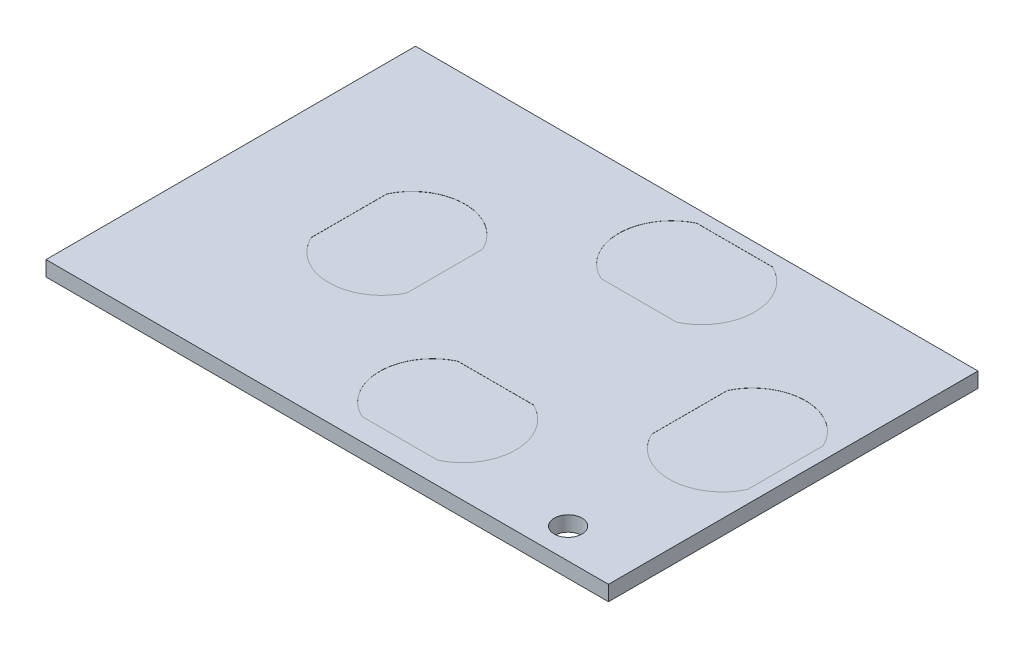
ISO-10303-21;
HEADER;
FILE_DESCRIPTION(('STEP AP214'),'2;1');
FILE_NAME('part.step','',(''),(''),'','','');
FILE_SCHEMA(('AUTOMOTIVE_DESIGN { 1 0 10303 214 1 1 1 1 }'));
ENDSEC;
DATA;
#1=APPLICATION_CONTEXT('core data for automotive mechanical design processes');
#2=APPLICATION_PROTOCOL_DEFINITION('international standard','automotive_design',2000,#1);
#3=PRODUCT_CONTEXT('',#1,'mechanical');
#4=PRODUCT('Part','Part','',(#3));
#5=PRODUCT_RELATED_PRODUCT_CATEGORY('part','',(#4));
#6=PRODUCT_DEFINITION_FORMATION('','',#4);
#7=PRODUCT_DEFINITION_CONTEXT('part definition',#1,'design');
#8=PRODUCT_DEFINITION('design','',#6,#7);
#9=PRODUCT_DEFINITION_SHAPE('','',#8);
#10=(LENGTH_UNIT() NAMED_UNIT(*) SI_UNIT(.MILLI.,.METRE.));
#11=(NAMED_UNIT(*) PLANE_ANGLE_UNIT() SI_UNIT($,.RADIAN.));
#12=(NAMED_UNIT(*) SI_UNIT($,.STERADIAN.) SOLID_ANGLE_UNIT());
#13=UNCERTAINTY_MEASURE_WITH_UNIT(LENGTH_MEASURE(1.E-05),#10,'distance_accuracy_value','');
#14=(GEOMETRIC_REPRESENTATION_CONTEXT(3) GLOBAL_UNCERTAINTY_ASSIGNED_CONTEXT((#13)) GLOBAL_UNIT_ASSIGNED_CONTEXT((#10,
#11,#12)) REPRESENTATION_CONTEXT('',''));
#15=CARTESIAN_POINT('',(0.,0.,0.));
#16=DIRECTION('',(0.,0.,1.));
#17=DIRECTION('',(1.,0.,0.));
#18=AXIS2_PLACEMENT_3D('',#15,#16,#17);
#19=CARTESIAN_POINT('',(0.,1.2,0.));
#20=DIRECTION('',(0.,-1.,0.));
#21=DIRECTION('',(0.,0.,-1.));
#22=AXIS2_PLACEMENT_3D('',#19,#20,#21);
#23=PLANE('',#22);
#24=DIRECTION('',(1.,0.,0.));
#25=VECTOR('',#24,1.);
#26=CARTESIAN_POINT('',(6.99999999999999,1.2,-6.05));
#27=LINE('',#26,#25);
#28=CARTESIAN_POINT('',(0.999999999999994,1.2,-6.05));
#29=VERTEX_POINT('',#28);
#30=CARTESIAN_POINT('',(6.99999999999999,1.2,-6.05));
#31=VERTEX_POINT('',#30);
#32=EDGE_CURVE('E202',#29,#31,#27,.T.);
#33=ORIENTED_EDGE('',*,*,#32,.F.);
#34=CARTESIAN_POINT('',(2.80833333333333,1.2,-9.85));
#35=DIRECTION('',(0.,1.,0.));
#36=DIRECTION('',(0.,0.,1.));
#37=AXIS2_PLACEMENT_3D('',#34,#35,#36);
#38=CIRCLE('',#37,4.20833333333334);
#39=CARTESIAN_POINT('',(0.999999999999994,1.2,-13.65));
#40=VERTEX_POINT('',#39);
#41=EDGE_CURVE('E51',#40,#29,#38,.T.);
#42=ORIENTED_EDGE('',*,*,#41,.F.);
#43=DIRECTION('',(-1.,0.,0.));
#44=VECTOR('',#43,1.);
#45=CARTESIAN_POINT('',(0.999999999999994,1.2,-13.65));
#46=LINE('',#45,#44);
#47=CARTESIAN_POINT('',(6.99999999999999,1.2,-13.65));
#48=VERTEX_POINT('',#47);
#49=EDGE_CURVE('E193',#48,#40,#46,.T.);
#50=ORIENTED_EDGE('',*,*,#49,.F.);
#51=CARTESIAN_POINT('',(5.19166666666666,1.2,-9.85));
#52=DIRECTION('',(0.,1.,0.));
#53=DIRECTION('',(0.,0.,-1.));
#54=AXIS2_PLACEMENT_3D('',#51,#52,#53);
#55=CIRCLE('',#54,4.20833333333334);
#56=EDGE_CURVE('E196',#31,#48,#55,.T.);
#57=ORIENTED_EDGE('',*,*,#56,.F.);
#58=EDGE_LOOP('',(#33,#42,#50,#57));
#59=FACE_BOUND('',#58,.T.);
#60=DIRECTION('',(0.,0.,-1.));
#61=VECTOR('',#60,1.);
#62=CARTESIAN_POINT('',(-5.70000000000001,1.2,2.625));
#63=LINE('',#62,#61);
#64=CARTESIAN_POINT('',(-5.70000000000001,1.2,2.625));
#65=VERTEX_POINT('',#64);
#66=CARTESIAN_POINT('',(-5.70000000000001,1.2,-3.375));
#67=VERTEX_POINT('',#66);
#68=EDGE_CURVE('E228',#65,#67,#63,.T.);
#69=ORIENTED_EDGE('',*,*,#68,.F.);
#70=CARTESIAN_POINT('',(-9.50000000000001,1.2,0.816666666666664));
#71=DIRECTION('',(0.,1.,0.));
#72=DIRECTION('',(0.,0.,1.));
#73=AXIS2_PLACEMENT_3D('',#70,#71,#72);
#74=CIRCLE('',#73,4.20833333333334);
#75=CARTESIAN_POINT('',(-13.3,1.2,2.625));
#76=VERTEX_POINT('',#75);
#77=EDGE_CURVE('E59',#76,#65,#74,.T.);
#78=ORIENTED_EDGE('',*,*,#77,.F.);
#79=DIRECTION('',(0.,0.,1.));
#80=VECTOR('',#79,1.);
#81=CARTESIAN_POINT('',(-13.3,1.2,-3.375));
#82=LINE('',#81,#80);
#83=CARTESIAN_POINT('',(-13.3,1.2,-3.375));
#84=VERTEX_POINT('',#83);
#85=EDGE_CURVE('E217',#84,#76,#82,.T.);
#86=ORIENTED_EDGE('',*,*,#85,.F.);
#87=CARTESIAN_POINT('',(-9.50000000000001,1.2,-1.56666666666666));
#88=DIRECTION('',(0.,1.,0.));
#89=DIRECTION('',(0.,0.,-1.));
#90=AXIS2_PLACEMENT_3D('',#87,#88,#89);
#91=CIRCLE('',#90,4.20833333333333);
#92=EDGE_CURVE('E232',#67,#84,#91,.T.);
#93=ORIENTED_EDGE('',*,*,#92,.F.);
#94=EDGE_LOOP('',(#69,#78,#86,#93));
#95=FACE_BOUND('',#94,.T.);
#96=DIRECTION('',(1.,0.,0.));
#97=VECTOR('',#96,1.);
#98=CARTESIAN_POINT('',(7.,1.2,12.9));
#99=LINE('',#98,#97);
#100=CARTESIAN_POINT('',(0.999999999999994,1.2,12.9));
#101=VERTEX_POINT('',#100);
#102=CARTESIAN_POINT('',(7.,1.2,12.9));
#103=VERTEX_POINT('',#102);
#104=EDGE_CURVE('E259',#101,#103,#99,.T.);
#105=ORIENTED_EDGE('',*,*,#104,.F.);
#106=CARTESIAN_POINT('',(2.80833333333333,1.2,9.1));
#107=DIRECTION('',(0.,1.,0.));
#108=DIRECTION('',(0.,0.,1.));
#109=AXIS2_PLACEMENT_3D('',#106,#107,#108);
#110=CIRCLE('',#109,4.20833333333333);
#111=CARTESIAN_POINT('',(0.999999999999994,1.2,5.3));
#112=VERTEX_POINT('',#111);
#113=EDGE_CURVE('E257',#112,#101,#110,.T.);
#114=ORIENTED_EDGE('',*,*,#113,.F.);
#115=DIRECTION('',(-1.,0.,0.));
#116=VECTOR('',#115,1.);
#117=CARTESIAN_POINT('',(0.999999999999994,1.2,5.3));
#118=LINE('',#117,#116);
#119=CARTESIAN_POINT('',(6.99999999999999,1.2,5.30000000000001));
#120=VERTEX_POINT('',#119);
#121=EDGE_CURVE('E247',#120,#112,#118,.T.);
#122=ORIENTED_EDGE('',*,*,#121,.F.);
#123=CARTESIAN_POINT('',(5.19166666666666,1.2,9.1));
#124=DIRECTION('',(0.,1.,0.));
#125=DIRECTION('',(0.,0.,-1.));
#126=AXIS2_PLACEMENT_3D('',#123,#124,#125);
#127=CIRCLE('',#126,4.20833333333333);
#128=EDGE_CURVE('E263',#103,#120,#127,.T.);
#129=ORIENTED_EDGE('',*,*,#128,.F.);
#130=EDGE_LOOP('',(#105,#114,#122,#129));
#131=FACE_BOUND('',#130,.T.);
#132=DIRECTION('',(0.,0.,-1.));
#133=VECTOR('',#132,1.);
#134=CARTESIAN_POINT('',(21.3,1.2,2.625));
#135=LINE('',#134,#133);
#136=CARTESIAN_POINT('',(21.3,1.2,2.625));
#137=VERTEX_POINT('',#136);
#138=CARTESIAN_POINT('',(21.3,1.2,-3.375));
#139=VERTEX_POINT('',#138);
#140=EDGE_CURVE('E291',#137,#139,#135,.T.);
#141=ORIENTED_EDGE('',*,*,#140,.F.);
#142=CARTESIAN_POINT('',(17.5,1.2,0.816666666666664));
#143=DIRECTION('',(0.,1.,0.));
#144=DIRECTION('',(0.,0.,1.));
#145=AXIS2_PLACEMENT_3D('',#142,#143,#144);
#146=CIRCLE('',#145,4.20833333333334);
#147=CARTESIAN_POINT('',(13.7,1.2,2.625));
#148=VERTEX_POINT('',#147);
#149=EDGE_CURVE('E289',#148,#137,#146,.T.);
#150=ORIENTED_EDGE('',*,*,#149,.F.);
#151=DIRECTION('',(0.,0.,1.));
#152=VECTOR('',#151,1.);
#153=CARTESIAN_POINT('',(13.7,1.2,-3.375));
#154=LINE('',#153,#152);
#155=CARTESIAN_POINT('',(13.7,1.2,-3.375));
#156=VERTEX_POINT('',#155);
#157=EDGE_CURVE('E279',#156,#148,#154,.T.);
#158=ORIENTED_EDGE('',*,*,#157,.F.);
#159=CARTESIAN_POINT('',(17.5,1.2,-1.56666666666666));
#160=DIRECTION('',(0.,1.,0.));
#161=DIRECTION('',(0.,0.,-1.));
#162=AXIS2_PLACEMENT_3D('',#159,#160,#161);
#163=CIRCLE('',#162,4.20833333333334);
#164=EDGE_CURVE('E294',#139,#156,#163,.T.);
#165=ORIENTED_EDGE('',*,*,#164,.F.);
#166=EDGE_LOOP('',(#141,#150,#158,#165));
#167=FACE_BOUND('',#166,.T.);
#168=DIRECTION('',(0.,0.,1.));
#169=VECTOR('',#168,1.);
#170=CARTESIAN_POINT('',(-22.3,1.2,14.65));
#171=LINE('',#170,#169);
#172=CARTESIAN_POINT('',(-22.3,1.2,-14.65));
#173=VERTEX_POINT('',#172);
#174=CARTESIAN_POINT('',(-22.3,1.2,14.65));
#175=VERTEX_POINT('',#174);
#176=EDGE_CURVE('E312',#173,#175,#171,.T.);
#177=ORIENTED_EDGE('',*,*,#176,.T.);
#178=DIRECTION('',(1.,0.,0.));
#179=VECTOR('',#178,1.);
#180=CARTESIAN_POINT('',(22.3,1.2,14.65));
#181=LINE('',#180,#179);
#182=CARTESIAN_POINT('',(22.3,1.2,14.65));
#183=VERTEX_POINT('',#182);
#184=EDGE_CURVE('E315',#175,#183,#181,.T.);
#185=ORIENTED_EDGE('',*,*,#184,.T.);
#186=DIRECTION('',(0.,0.,-1.));
#187=VECTOR('',#186,1.);
#188=CARTESIAN_POINT('',(22.3,1.2,-14.65));
#189=LINE('',#188,#187);
#190=CARTESIAN_POINT('',(22.3,1.2,-14.65));
#191=VERTEX_POINT('',#190);
#192=EDGE_CURVE('E318',#183,#191,#189,.T.);
#193=ORIENTED_EDGE('',*,*,#192,.T.);
#194=DIRECTION('',(-1.,0.,0.));
#195=VECTOR('',#194,1.);
#196=CARTESIAN_POINT('',(-22.3,1.2,-14.65));
#197=LINE('',#196,#195);
#198=EDGE_CURVE('E320',#191,#173,#197,.T.);
#199=ORIENTED_EDGE('',*,*,#198,.T.);
#200=EDGE_LOOP('',(#177,#185,#193,#199));
#201=FACE_BOUND('',#200,.T.);
#202=CARTESIAN_POINT('',(16.7,1.2,12.25));
#203=DIRECTION('',(0.,1.,0.));
#204=DIRECTION('',(0.,0.,1.));
#205=AXIS2_PLACEMENT_3D('',#202,#203,#204);
#206=CIRCLE('',#205,1.1);
#207=CARTESIAN_POINT('',(16.7,1.2,13.35));
#208=VERTEX_POINT('',#207);
#209=EDGE_CURVE('E306',#208,#208,#206,.T.);
#210=ORIENTED_EDGE('',*,*,#209,.F.);
#211=EDGE_LOOP('',(#210));
#212=FACE_BOUND('',#211,.T.);
#213=ADVANCED_FACE('F36',(#59,#95,#131,#167,#201,#212),#23,.F.);
#214=CARTESIAN_POINT('',(0.,0.,0.));
#215=DIRECTION('',(0.,-1.,0.));
#216=DIRECTION('',(0.,0.,-1.));
#217=AXIS2_PLACEMENT_3D('',#214,#215,#216);
#218=PLANE('',#217);
#219=DIRECTION('',(0.,0.,1.));
#220=VECTOR('',#219,1.);
#221=CARTESIAN_POINT('',(-22.3,0.,14.65));
#222=LINE('',#221,#220);
#223=CARTESIAN_POINT('',(-22.3,0.,-14.65));
#224=VERTEX_POINT('',#223);
#225=CARTESIAN_POINT('',(-22.3,0.,14.65));
#226=VERTEX_POINT('',#225);
#227=EDGE_CURVE('E309',#224,#226,#222,.T.);
#228=ORIENTED_EDGE('',*,*,#227,.F.);
#229=DIRECTION('',(-1.,0.,0.));
#230=VECTOR('',#229,1.);
#231=CARTESIAN_POINT('',(-22.3,0.,-14.65));
#232=LINE('',#231,#230);
#233=CARTESIAN_POINT('',(22.3,0.,-14.65));
#234=VERTEX_POINT('',#233);
#235=EDGE_CURVE('E316',#234,#224,#232,.T.);
#236=ORIENTED_EDGE('',*,*,#235,.F.);
#237=DIRECTION('',(0.,0.,-1.));
#238=VECTOR('',#237,1.);
#239=CARTESIAN_POINT('',(22.3,0.,-14.65));
#240=LINE('',#239,#238);
#241=CARTESIAN_POINT('',(22.3,0.,14.65));
#242=VERTEX_POINT('',#241);
#243=EDGE_CURVE('E327',#242,#234,#240,.T.);
#244=ORIENTED_EDGE('',*,*,#243,.F.);
#245=DIRECTION('',(1.,0.,0.));
#246=VECTOR('',#245,1.);
#247=CARTESIAN_POINT('',(22.3,0.,14.65));
#248=LINE('',#247,#246);
#249=EDGE_CURVE('E325',#226,#242,#248,.T.);
#250=ORIENTED_EDGE('',*,*,#249,.F.);
#251=EDGE_LOOP('',(#228,#236,#244,#250));
#252=FACE_BOUND('',#251,.T.);
#253=CARTESIAN_POINT('',(16.7,0.,12.25));
#254=DIRECTION('',(0.,1.,0.));
#255=DIRECTION('',(0.,0.,1.));
#256=AXIS2_PLACEMENT_3D('',#253,#254,#255);
#257=CIRCLE('',#256,1.1);
#258=CARTESIAN_POINT('',(16.7,0.,13.35));
#259=VERTEX_POINT('',#258);
#260=EDGE_CURVE('E209',#259,#259,#257,.T.);
#261=ORIENTED_EDGE('',*,*,#260,.T.);
#262=EDGE_LOOP('',(#261));
#263=FACE_BOUND('',#262,.T.);
#264=ADVANCED_FACE('F345',(#252,#263),#218,.T.);
#265=CARTESIAN_POINT('',(-22.3,1.2,14.65));
#266=DIRECTION('',(1.,0.,0.));
#267=DIRECTION('',(0.,0.,-1.));
#268=AXIS2_PLACEMENT_3D('',#265,#266,#267);
#269=PLANE('',#268);
#270=ORIENTED_EDGE('',*,*,#227,.T.);
#271=DIRECTION('',(0.,-1.,0.));
#272=VECTOR('',#271,1.);
#273=CARTESIAN_POINT('',(-22.3,1.2,14.65));
#274=LINE('',#273,#272);
#275=EDGE_CURVE('E11',#175,#226,#274,.T.);
#276=ORIENTED_EDGE('',*,*,#275,.F.);
#277=ORIENTED_EDGE('',*,*,#176,.F.);
#278=DIRECTION('',(0.,-1.,0.));
#279=VECTOR('',#278,1.);
#280=CARTESIAN_POINT('',(-22.3,1.2,-14.65));
#281=LINE('',#280,#279);
#282=EDGE_CURVE('E322',#173,#224,#281,.T.);
#283=ORIENTED_EDGE('',*,*,#282,.T.);
#284=EDGE_LOOP('',(#270,#276,#277,#283));
#285=FACE_BOUND('',#284,.T.);
#286=ADVANCED_FACE('F38',(#285),#269,.F.);
#287=CARTESIAN_POINT('',(22.3,1.2,14.65));
#288=DIRECTION('',(0.,0.,-1.));
#289=DIRECTION('',(-1.,0.,0.));
#290=AXIS2_PLACEMENT_3D('',#287,#288,#289);
#291=PLANE('',#290);
#292=ORIENTED_EDGE('',*,*,#249,.T.);
#293=DIRECTION('',(0.,-1.,0.));
#294=VECTOR('',#293,1.);
#295=CARTESIAN_POINT('',(22.3,1.2,14.65));
#296=LINE('',#295,#294);
#297=EDGE_CURVE('E44',#183,#242,#296,.T.);
#298=ORIENTED_EDGE('',*,*,#297,.F.);
#299=ORIENTED_EDGE('',*,*,#184,.F.);
#300=ORIENTED_EDGE('',*,*,#275,.T.);
#301=EDGE_LOOP('',(#292,#298,#299,#300));
#302=FACE_BOUND('',#301,.T.);
#303=ADVANCED_FACE('F356',(#302),#291,.F.);
#304=CARTESIAN_POINT('',(22.3,1.2,-14.65));
#305=DIRECTION('',(-1.,0.,0.));
#306=DIRECTION('',(0.,0.,1.));
#307=AXIS2_PLACEMENT_3D('',#304,#305,#306);
#308=PLANE('',#307);
#309=ORIENTED_EDGE('',*,*,#243,.T.);
#310=DIRECTION('',(0.,-1.,0.));
#311=VECTOR('',#310,1.);
#312=CARTESIAN_POINT('',(22.3,1.2,-14.65));
#313=LINE('',#312,#311);
#314=EDGE_CURVE('E332',#191,#234,#313,.T.);
#315=ORIENTED_EDGE('',*,*,#314,.F.);
#316=ORIENTED_EDGE('',*,*,#192,.F.);
#317=ORIENTED_EDGE('',*,*,#297,.T.);
#318=EDGE_LOOP('',(#309,#315,#316,#317));
#319=FACE_BOUND('',#318,.T.);
#320=ADVANCED_FACE('F339',(#319),#308,.F.);
#321=CARTESIAN_POINT('',(-22.3,1.2,-14.65));
#322=DIRECTION('',(0.,0.,1.));
#323=DIRECTION('',(1.,0.,0.));
#324=AXIS2_PLACEMENT_3D('',#321,#322,#323);
#325=PLANE('',#324);
#326=ORIENTED_EDGE('',*,*,#235,.T.);
#327=ORIENTED_EDGE('',*,*,#282,.F.);
#328=ORIENTED_EDGE('',*,*,#198,.F.);
#329=ORIENTED_EDGE('',*,*,#314,.T.);
#330=EDGE_LOOP('',(#326,#327,#328,#329));
#331=FACE_BOUND('',#330,.T.);
#332=ADVANCED_FACE('F349',(#331),#325,.F.);
#333=CARTESIAN_POINT('',(16.7,1.2,12.25));
#334=DIRECTION('',(0.,-1.,0.));
#335=DIRECTION('',(0.,0.,-1.));
#336=AXIS2_PLACEMENT_3D('',#333,#334,#335);
#337=CYLINDRICAL_SURFACE('',#336,1.1);
#338=ORIENTED_EDGE('',*,*,#209,.T.);
#339=EDGE_LOOP('',(#338));
#340=FACE_BOUND('',#339,.T.);
#341=ORIENTED_EDGE('',*,*,#260,.F.);
#342=EDGE_LOOP('',(#341));
#343=FACE_BOUND('',#342,.T.);
#344=ADVANCED_FACE('F372',(#340,#343),#337,.F.);
#345=CARTESIAN_POINT('',(17.5,1.19,0.816666666666664));
#346=DIRECTION('',(0.,1.,0.));
#347=DIRECTION('',(0.,0.,1.));
#348=AXIS2_PLACEMENT_3D('',#345,#346,#347);
#349=CYLINDRICAL_SURFACE('',#348,4.20833333333334);
#350=ORIENTED_EDGE('',*,*,#149,.T.);
#351=DIRECTION('',(0.,1.,0.));
#352=VECTOR('',#351,1.);
#353=CARTESIAN_POINT('',(21.3,1.19,2.625));
#354=LINE('',#353,#352);
#355=CARTESIAN_POINT('',(21.3,1.19,2.625));
#356=VERTEX_POINT('',#355);
#357=EDGE_CURVE('E288',#356,#137,#354,.T.);
#358=ORIENTED_EDGE('',*,*,#357,.F.);
#359=CARTESIAN_POINT('',(17.5,1.19,0.816666666666664));
#360=DIRECTION('',(0.,1.,0.));
#361=DIRECTION('',(0.,0.,1.));
#362=AXIS2_PLACEMENT_3D('',#359,#360,#361);
#363=CIRCLE('',#362,4.20833333333334);
#364=CARTESIAN_POINT('',(13.7,1.19,2.625));
#365=VERTEX_POINT('',#364);
#366=EDGE_CURVE('E275',#365,#356,#363,.T.);
#367=ORIENTED_EDGE('',*,*,#366,.F.);
#368=DIRECTION('',(0.,1.,0.));
#369=VECTOR('',#368,1.);
#370=CARTESIAN_POINT('',(13.7,1.19,2.625));
#371=LINE('',#370,#369);
#372=EDGE_CURVE('E260',#365,#148,#371,.T.);
#373=ORIENTED_EDGE('',*,*,#372,.T.);
#374=EDGE_LOOP('',(#350,#358,#367,#373));
#375=FACE_BOUND('',#374,.T.);
#376=ADVANCED_FACE('F379',(#375),#349,.F.);
#377=CARTESIAN_POINT('',(13.7,1.19,-3.375));
#378=DIRECTION('',(-1.,0.,0.));
#379=DIRECTION('',(0.,0.,1.));
#380=AXIS2_PLACEMENT_3D('',#377,#378,#379);
#381=PLANE('',#380);
#382=ORIENTED_EDGE('',*,*,#157,.T.);
#383=ORIENTED_EDGE('',*,*,#372,.F.);
#384=DIRECTION('',(0.,0.,1.));
#385=VECTOR('',#384,1.);
#386=CARTESIAN_POINT('',(13.7,1.19,-3.375));
#387=LINE('',#386,#385);
#388=CARTESIAN_POINT('',(13.7,1.19,-3.375));
#389=VERTEX_POINT('',#388);
#390=EDGE_CURVE('E285',#389,#365,#387,.T.);
#391=ORIENTED_EDGE('',*,*,#390,.F.);
#392=DIRECTION('',(0.,1.,0.));
#393=VECTOR('',#392,1.);
#394=CARTESIAN_POINT('',(13.7,1.19,-3.375));
#395=LINE('',#394,#393);
#396=EDGE_CURVE('E300',#389,#156,#395,.T.);
#397=ORIENTED_EDGE('',*,*,#396,.T.);
#398=EDGE_LOOP('',(#382,#383,#391,#397));
#399=FACE_BOUND('',#398,.T.);
#400=ADVANCED_FACE('F384',(#399),#381,.F.);
#401=CARTESIAN_POINT('',(17.5,1.19,-1.56666666666666));
#402=DIRECTION('',(0.,1.,0.));
#403=DIRECTION('',(0.,0.,1.));
#404=AXIS2_PLACEMENT_3D('',#401,#402,#403);
#405=CYLINDRICAL_SURFACE('',#404,4.20833333333334);
#406=ORIENTED_EDGE('',*,*,#164,.T.);
#407=ORIENTED_EDGE('',*,*,#396,.F.);
#408=CARTESIAN_POINT('',(17.5,1.19,-1.56666666666666));
#409=DIRECTION('',(0.,1.,0.));
#410=DIRECTION('',(0.,0.,-1.));
#411=AXIS2_PLACEMENT_3D('',#408,#409,#410);
#412=CIRCLE('',#411,4.20833333333334);
#413=CARTESIAN_POINT('',(21.3,1.19,-3.375));
#414=VERTEX_POINT('',#413);
#415=EDGE_CURVE('E282',#414,#389,#412,.T.);
#416=ORIENTED_EDGE('',*,*,#415,.F.);
#417=DIRECTION('',(0.,1.,0.));
#418=VECTOR('',#417,1.);
#419=CARTESIAN_POINT('',(21.3,1.19,-3.375));
#420=LINE('',#419,#418);
#421=EDGE_CURVE('E302',#414,#139,#420,.T.);
#422=ORIENTED_EDGE('',*,*,#421,.T.);
#423=EDGE_LOOP('',(#406,#407,#416,#422));
#424=FACE_BOUND('',#423,.T.);
#425=ADVANCED_FACE('F392',(#424),#405,.F.);
#426=CARTESIAN_POINT('',(21.3,1.19,2.625));
#427=DIRECTION('',(1.,0.,0.));
#428=DIRECTION('',(0.,0.,-1.));
#429=AXIS2_PLACEMENT_3D('',#426,#427,#428);
#430=PLANE('',#429);
#431=ORIENTED_EDGE('',*,*,#140,.T.);
#432=ORIENTED_EDGE('',*,*,#421,.F.);
#433=DIRECTION('',(0.,0.,-1.));
#434=VECTOR('',#433,1.);
#435=CARTESIAN_POINT('',(21.3,1.19,2.625));
#436=LINE('',#435,#434);
#437=EDGE_CURVE('E278',#356,#414,#436,.T.);
#438=ORIENTED_EDGE('',*,*,#437,.F.);
#439=ORIENTED_EDGE('',*,*,#357,.T.);
#440=EDGE_LOOP('',(#431,#432,#438,#439));
#441=FACE_BOUND('',#440,.T.);
#442=ADVANCED_FACE('F396',(#441),#430,.F.);
#443=CARTESIAN_POINT('',(17.5,1.19,0.816666666666664));
#444=DIRECTION('',(0.,1.,0.));
#445=DIRECTION('',(0.,0.,1.));
#446=AXIS2_PLACEMENT_3D('',#443,#444,#445);
#447=PLANE('',#446);
#448=ORIENTED_EDGE('',*,*,#366,.T.);
#449=ORIENTED_EDGE('',*,*,#437,.T.);
#450=ORIENTED_EDGE('',*,*,#415,.T.);
#451=ORIENTED_EDGE('',*,*,#390,.T.);
#452=EDGE_LOOP('',(#448,#449,#450,#451));
#453=FACE_BOUND('',#452,.T.);
#454=ADVANCED_FACE('F399',(#453),#447,.T.);
#455=CARTESIAN_POINT('',(2.80833333333333,1.19,9.1));
#456=DIRECTION('',(0.,1.,0.));
#457=DIRECTION('',(0.,0.,1.));
#458=AXIS2_PLACEMENT_3D('',#455,#456,#457);
#459=CYLINDRICAL_SURFACE('',#458,4.20833333333333);
#460=ORIENTED_EDGE('',*,*,#113,.T.);
#461=DIRECTION('',(0.,1.,0.));
#462=VECTOR('',#461,1.);
#463=CARTESIAN_POINT('',(0.999999999999994,1.19,12.9));
#464=LINE('',#463,#462);
#465=CARTESIAN_POINT('',(0.999999999999994,1.19,12.9));
#466=VERTEX_POINT('',#465);
#467=EDGE_CURVE('E256',#466,#101,#464,.T.);
#468=ORIENTED_EDGE('',*,*,#467,.F.);
#469=CARTESIAN_POINT('',(2.80833333333333,1.19,9.1));
#470=DIRECTION('',(0.,1.,0.));
#471=DIRECTION('',(0.,0.,1.));
#472=AXIS2_PLACEMENT_3D('',#469,#470,#471);
#473=CIRCLE('',#472,4.20833333333333);
#474=CARTESIAN_POINT('',(0.999999999999994,1.19,5.3));
#475=VERTEX_POINT('',#474);
#476=EDGE_CURVE('E243',#475,#466,#473,.T.);
#477=ORIENTED_EDGE('',*,*,#476,.F.);
#478=DIRECTION('',(0.,1.,0.));
#479=VECTOR('',#478,1.);
#480=CARTESIAN_POINT('',(0.999999999999994,1.19,5.3));
#481=LINE('',#480,#479);
#482=EDGE_CURVE('E229',#475,#112,#481,.T.);
#483=ORIENTED_EDGE('',*,*,#482,.T.);
#484=EDGE_LOOP('',(#460,#468,#477,#483));
#485=FACE_BOUND('',#484,.T.);
#486=ADVANCED_FACE('F406',(#485),#459,.F.);
#487=CARTESIAN_POINT('',(0.999999999999994,1.19,5.3));
#488=DIRECTION('',(0.,0.,-1.));
#489=DIRECTION('',(-1.,0.,0.));
#490=AXIS2_PLACEMENT_3D('',#487,#488,#489);
#491=PLANE('',#490);
#492=ORIENTED_EDGE('',*,*,#121,.T.);
#493=ORIENTED_EDGE('',*,*,#482,.F.);
#494=DIRECTION('',(-1.,0.,0.));
#495=VECTOR('',#494,1.);
#496=CARTESIAN_POINT('',(0.999999999999994,1.19,5.3));
#497=LINE('',#496,#495);
#498=CARTESIAN_POINT('',(6.99999999999999,1.19,5.30000000000001));
#499=VERTEX_POINT('',#498);
#500=EDGE_CURVE('E253',#499,#475,#497,.T.);
#501=ORIENTED_EDGE('',*,*,#500,.F.);
#502=DIRECTION('',(0.,1.,0.));
#503=VECTOR('',#502,1.);
#504=CARTESIAN_POINT('',(6.99999999999999,1.19,5.30000000000001));
#505=LINE('',#504,#503);
#506=EDGE_CURVE('E269',#499,#120,#505,.T.);
#507=ORIENTED_EDGE('',*,*,#506,.T.);
#508=EDGE_LOOP('',(#492,#493,#501,#507));
#509=FACE_BOUND('',#508,.T.);
#510=ADVANCED_FACE('F410',(#509),#491,.F.);
#511=CARTESIAN_POINT('',(5.19166666666666,1.19,9.1));
#512=DIRECTION('',(0.,1.,0.));
#513=DIRECTION('',(0.,0.,1.));
#514=AXIS2_PLACEMENT_3D('',#511,#512,#513);
#515=CYLINDRICAL_SURFACE('',#514,4.20833333333333);
#516=ORIENTED_EDGE('',*,*,#128,.T.);
#517=ORIENTED_EDGE('',*,*,#506,.F.);
#518=CARTESIAN_POINT('',(5.19166666666666,1.19,9.1));
#519=DIRECTION('',(0.,1.,0.));
#520=DIRECTION('',(0.,0.,-1.));
#521=AXIS2_PLACEMENT_3D('',#518,#519,#520);
#522=CIRCLE('',#521,4.20833333333333);
#523=CARTESIAN_POINT('',(7.,1.19,12.9));
#524=VERTEX_POINT('',#523);
#525=EDGE_CURVE('E250',#524,#499,#522,.T.);
#526=ORIENTED_EDGE('',*,*,#525,.F.);
#527=DIRECTION('',(0.,1.,0.));
#528=VECTOR('',#527,1.);
#529=CARTESIAN_POINT('',(7.,1.19,12.9));
#530=LINE('',#529,#528);
#531=EDGE_CURVE('E271',#524,#103,#530,.T.);
#532=ORIENTED_EDGE('',*,*,#531,.T.);
#533=EDGE_LOOP('',(#516,#517,#526,#532));
#534=FACE_BOUND('',#533,.T.);
#535=ADVANCED_FACE('F416',(#534),#515,.F.);
#536=CARTESIAN_POINT('',(7.,1.19,12.9));
#537=DIRECTION('',(0.,0.,1.));
#538=DIRECTION('',(1.,0.,0.));
#539=AXIS2_PLACEMENT_3D('',#536,#537,#538);
#540=PLANE('',#539);
#541=ORIENTED_EDGE('',*,*,#104,.T.);
#542=ORIENTED_EDGE('',*,*,#531,.F.);
#543=DIRECTION('',(1.,0.,0.));
#544=VECTOR('',#543,1.);
#545=CARTESIAN_POINT('',(7.,1.19,12.9));
#546=LINE('',#545,#544);
#547=EDGE_CURVE('E246',#466,#524,#546,.T.);
#548=ORIENTED_EDGE('',*,*,#547,.F.);
#549=ORIENTED_EDGE('',*,*,#467,.T.);
#550=EDGE_LOOP('',(#541,#542,#548,#549));
#551=FACE_BOUND('',#550,.T.);
#552=ADVANCED_FACE('F412',(#551),#540,.F.);
#553=CARTESIAN_POINT('',(2.80833333333333,1.19,9.1));
#554=DIRECTION('',(0.,1.,0.));
#555=DIRECTION('',(0.,0.,1.));
#556=AXIS2_PLACEMENT_3D('',#553,#554,#555);
#557=PLANE('',#556);
#558=ORIENTED_EDGE('',*,*,#476,.T.);
#559=ORIENTED_EDGE('',*,*,#547,.T.);
#560=ORIENTED_EDGE('',*,*,#525,.T.);
#561=ORIENTED_EDGE('',*,*,#500,.T.);
#562=EDGE_LOOP('',(#558,#559,#560,#561));
#563=FACE_BOUND('',#562,.T.);
#564=ADVANCED_FACE('F415',(#563),#557,.T.);
#565=CARTESIAN_POINT('',(-9.50000000000001,1.19,0.816666666666664));
#566=DIRECTION('',(0.,1.,0.));
#567=DIRECTION('',(0.,0.,1.));
#568=AXIS2_PLACEMENT_3D('',#565,#566,#567);
#569=CYLINDRICAL_SURFACE('',#568,4.20833333333334);
#570=ORIENTED_EDGE('',*,*,#77,.T.);
#571=DIRECTION('',(0.,1.,0.));
#572=VECTOR('',#571,1.);
#573=CARTESIAN_POINT('',(-5.70000000000001,1.19,2.625));
#574=LINE('',#573,#572);
#575=CARTESIAN_POINT('',(-5.70000000000001,1.19,2.625));
#576=VERTEX_POINT('',#575);
#577=EDGE_CURVE('E226',#576,#65,#574,.T.);
#578=ORIENTED_EDGE('',*,*,#577,.F.);
#579=CARTESIAN_POINT('',(-9.50000000000001,1.19,0.816666666666664));
#580=DIRECTION('',(0.,1.,0.));
#581=DIRECTION('',(0.,0.,1.));
#582=AXIS2_PLACEMENT_3D('',#579,#580,#581);
#583=CIRCLE('',#582,4.20833333333334);
#584=CARTESIAN_POINT('',(-13.3,1.19,2.625));
#585=VERTEX_POINT('',#584);
#586=EDGE_CURVE('E213',#585,#576,#583,.T.);
#587=ORIENTED_EDGE('',*,*,#586,.F.);
#588=DIRECTION('',(0.,1.,0.));
#589=VECTOR('',#588,1.);
#590=CARTESIAN_POINT('',(-13.3,1.19,2.625));
#591=LINE('',#590,#589);
#592=EDGE_CURVE('E203',#585,#76,#591,.T.);
#593=ORIENTED_EDGE('',*,*,#592,.T.);
#594=EDGE_LOOP('',(#570,#578,#587,#593));
#595=FACE_BOUND('',#594,.T.);
#596=ADVANCED_FACE('F426',(#595),#569,.F.);
#597=CARTESIAN_POINT('',(-13.3,1.19,-3.375));
#598=DIRECTION('',(-1.,0.,0.));
#599=DIRECTION('',(0.,0.,1.));
#600=AXIS2_PLACEMENT_3D('',#597,#598,#599);
#601=PLANE('',#600);
#602=ORIENTED_EDGE('',*,*,#85,.T.);
#603=ORIENTED_EDGE('',*,*,#592,.F.);
#604=DIRECTION('',(0.,0.,1.));
#605=VECTOR('',#604,1.);
#606=CARTESIAN_POINT('',(-13.3,1.19,-3.375));
#607=LINE('',#606,#605);
#608=CARTESIAN_POINT('',(-13.3,1.19,-3.375));
#609=VERTEX_POINT('',#608);
#610=EDGE_CURVE('E223',#609,#585,#607,.T.);
#611=ORIENTED_EDGE('',*,*,#610,.F.);
#612=DIRECTION('',(0.,1.,0.));
#613=VECTOR('',#612,1.);
#614=CARTESIAN_POINT('',(-13.3,1.19,-3.375));
#615=LINE('',#614,#613);
#616=EDGE_CURVE('E238',#609,#84,#615,.T.);
#617=ORIENTED_EDGE('',*,*,#616,.T.);
#618=EDGE_LOOP('',(#602,#603,#611,#617));
#619=FACE_BOUND('',#618,.T.);
#620=ADVANCED_FACE('F430',(#619),#601,.F.);
#621=CARTESIAN_POINT('',(-9.50000000000001,1.19,-1.56666666666666));
#622=DIRECTION('',(0.,1.,0.));
#623=DIRECTION('',(0.,0.,1.));
#624=AXIS2_PLACEMENT_3D('',#621,#622,#623);
#625=CYLINDRICAL_SURFACE('',#624,4.20833333333333);
#626=ORIENTED_EDGE('',*,*,#92,.T.);
#627=ORIENTED_EDGE('',*,*,#616,.F.);
#628=CARTESIAN_POINT('',(-9.50000000000001,1.19,-1.56666666666666));
#629=DIRECTION('',(0.,1.,0.));
#630=DIRECTION('',(0.,0.,-1.));
#631=AXIS2_PLACEMENT_3D('',#628,#629,#630);
#632=CIRCLE('',#631,4.20833333333333);
#633=CARTESIAN_POINT('',(-5.70000000000001,1.19,-3.375));
#634=VERTEX_POINT('',#633);
#635=EDGE_CURVE('E220',#634,#609,#632,.T.);
#636=ORIENTED_EDGE('',*,*,#635,.F.);
#637=DIRECTION('',(0.,1.,0.));
#638=VECTOR('',#637,1.);
#639=CARTESIAN_POINT('',(-5.70000000000001,1.19,-3.375));
#640=LINE('',#639,#638);
#641=EDGE_CURVE('E240',#634,#67,#640,.T.);
#642=ORIENTED_EDGE('',*,*,#641,.T.);
#643=EDGE_LOOP('',(#626,#627,#636,#642));
#644=FACE_BOUND('',#643,.T.);
#645=ADVANCED_FACE('F435',(#644),#625,.F.);
#646=CARTESIAN_POINT('',(-5.70000000000001,1.19,2.625));
#647=DIRECTION('',(1.,0.,0.));
#648=DIRECTION('',(0.,0.,-1.));
#649=AXIS2_PLACEMENT_3D('',#646,#647,#648);
#650=PLANE('',#649);
#651=ORIENTED_EDGE('',*,*,#68,.T.);
#652=ORIENTED_EDGE('',*,*,#641,.F.);
#653=DIRECTION('',(0.,0.,-1.));
#654=VECTOR('',#653,1.);
#655=CARTESIAN_POINT('',(-5.70000000000001,1.19,2.625));
#656=LINE('',#655,#654);
#657=EDGE_CURVE('E216',#576,#634,#656,.T.);
#658=ORIENTED_EDGE('',*,*,#657,.F.);
#659=ORIENTED_EDGE('',*,*,#577,.T.);
#660=EDGE_LOOP('',(#651,#652,#658,#659));
#661=FACE_BOUND('',#660,.T.);
#662=ADVANCED_FACE('F431',(#661),#650,.F.);
#663=CARTESIAN_POINT('',(-9.50000000000001,1.19,0.816666666666664));
#664=DIRECTION('',(0.,1.,0.));
#665=DIRECTION('',(0.,0.,1.));
#666=AXIS2_PLACEMENT_3D('',#663,#664,#665);
#667=PLANE('',#666);
#668=ORIENTED_EDGE('',*,*,#586,.T.);
#669=ORIENTED_EDGE('',*,*,#657,.T.);
#670=ORIENTED_EDGE('',*,*,#635,.T.);
#671=ORIENTED_EDGE('',*,*,#610,.T.);
#672=EDGE_LOOP('',(#668,#669,#670,#671));
#673=FACE_BOUND('',#672,.T.);
#674=ADVANCED_FACE('F434',(#673),#667,.T.);
#675=CARTESIAN_POINT('',(2.80833333333333,1.19,-9.85));
#676=DIRECTION('',(0.,1.,0.));
#677=DIRECTION('',(0.,0.,1.));
#678=AXIS2_PLACEMENT_3D('',#675,#676,#677);
#679=CYLINDRICAL_SURFACE('',#678,4.20833333333334);
#680=ORIENTED_EDGE('',*,*,#41,.T.);
#681=DIRECTION('',(0.,1.,0.));
#682=VECTOR('',#681,1.);
#683=CARTESIAN_POINT('',(0.999999999999994,1.19,-6.05));
#684=LINE('',#683,#682);
#685=CARTESIAN_POINT('',(0.999999999999994,1.19,-6.05));
#686=VERTEX_POINT('',#685);
#687=EDGE_CURVE('E171',#686,#29,#684,.T.);
#688=ORIENTED_EDGE('',*,*,#687,.F.);
#689=CARTESIAN_POINT('',(2.80833333333333,1.19,-9.85));
#690=DIRECTION('',(0.,1.,0.));
#691=DIRECTION('',(0.,0.,1.));
#692=AXIS2_PLACEMENT_3D('',#689,#690,#691);
#693=CIRCLE('',#692,4.20833333333334);
#694=CARTESIAN_POINT('',(0.999999999999994,1.19,-13.65));
#695=VERTEX_POINT('',#694);
#696=EDGE_CURVE('E175',#695,#686,#693,.T.);
#697=ORIENTED_EDGE('',*,*,#696,.F.);
#698=DIRECTION('',(0.,1.,0.));
#699=VECTOR('',#698,1.);
#700=CARTESIAN_POINT('',(0.999999999999994,1.19,-13.65));
#701=LINE('',#700,#699);
#702=EDGE_CURVE('E207',#695,#40,#701,.T.);
#703=ORIENTED_EDGE('',*,*,#702,.T.);
#704=EDGE_LOOP('',(#680,#688,#697,#703));
#705=FACE_BOUND('',#704,.T.);
#706=ADVANCED_FACE('F173',(#705),#679,.F.);
#707=CARTESIAN_POINT('',(0.999999999999994,1.19,-13.65));
#708=DIRECTION('',(0.,0.,-1.));
#709=DIRECTION('',(-1.,0.,0.));
#710=AXIS2_PLACEMENT_3D('',#707,#708,#709);
#711=PLANE('',#710);
#712=ORIENTED_EDGE('',*,*,#49,.T.);
#713=ORIENTED_EDGE('',*,*,#702,.F.);
#714=DIRECTION('',(-1.,0.,0.));
#715=VECTOR('',#714,1.);
#716=CARTESIAN_POINT('',(0.999999999999994,1.19,-13.65));
#717=LINE('',#716,#715);
#718=CARTESIAN_POINT('',(6.99999999999999,1.19,-13.65));
#719=VERTEX_POINT('',#718);
#720=EDGE_CURVE('E181',#719,#695,#717,.T.);
#721=ORIENTED_EDGE('',*,*,#720,.F.);
#722=DIRECTION('',(0.,1.,0.));
#723=VECTOR('',#722,1.);
#724=CARTESIAN_POINT('',(6.99999999999999,1.19,-13.65));
#725=LINE('',#724,#723);
#726=EDGE_CURVE('E210',#719,#48,#725,.T.);
#727=ORIENTED_EDGE('',*,*,#726,.T.);
#728=EDGE_LOOP('',(#712,#713,#721,#727));
#729=FACE_BOUND('',#728,.T.);
#730=ADVANCED_FACE('F448',(#729),#711,.F.);
#731=CARTESIAN_POINT('',(5.19166666666666,1.19,-9.85));
#732=DIRECTION('',(0.,1.,0.));
#733=DIRECTION('',(0.,0.,1.));
#734=AXIS2_PLACEMENT_3D('',#731,#732,#733);
#735=CYLINDRICAL_SURFACE('',#734,4.20833333333334);
#736=ORIENTED_EDGE('',*,*,#56,.T.);
#737=ORIENTED_EDGE('',*,*,#726,.F.);
#738=CARTESIAN_POINT('',(5.19166666666666,1.19,-9.85));
#739=DIRECTION('',(0.,1.,0.));
#740=DIRECTION('',(0.,0.,-1.));
#741=AXIS2_PLACEMENT_3D('',#738,#739,#740);
#742=CIRCLE('',#741,4.20833333333334);
#743=CARTESIAN_POINT('',(6.99999999999999,1.19,-6.05));
#744=VERTEX_POINT('',#743);
#745=EDGE_CURVE('E189',#744,#719,#742,.T.);
#746=ORIENTED_EDGE('',*,*,#745,.F.);
#747=DIRECTION('',(0.,1.,0.));
#748=VECTOR('',#747,1.);
#749=CARTESIAN_POINT('',(6.99999999999999,1.19,-6.05));
#750=LINE('',#749,#748);
#751=EDGE_CURVE('E180',#744,#31,#750,.T.);
#752=ORIENTED_EDGE('',*,*,#751,.T.);
#753=EDGE_LOOP('',(#736,#737,#746,#752));
#754=FACE_BOUND('',#753,.T.);
#755=ADVANCED_FACE('F451',(#754),#735,.F.);
#756=CARTESIAN_POINT('',(6.99999999999999,1.19,-6.05));
#757=DIRECTION('',(0.,0.,1.));
#758=DIRECTION('',(1.,0.,0.));
#759=AXIS2_PLACEMENT_3D('',#756,#757,#758);
#760=PLANE('',#759);
#761=ORIENTED_EDGE('',*,*,#32,.T.);
#762=ORIENTED_EDGE('',*,*,#751,.F.);
#763=DIRECTION('',(1.,0.,0.));
#764=VECTOR('',#763,1.);
#765=CARTESIAN_POINT('',(6.99999999999999,1.19,-6.05));
#766=LINE('',#765,#764);
#767=EDGE_CURVE('E184',#686,#744,#766,.T.);
#768=ORIENTED_EDGE('',*,*,#767,.F.);
#769=ORIENTED_EDGE('',*,*,#687,.T.);
#770=EDGE_LOOP('',(#761,#762,#768,#769));
#771=FACE_BOUND('',#770,.T.);
#772=ADVANCED_FACE('F185',(#771),#760,.F.);
#773=CARTESIAN_POINT('',(2.80833333333333,1.19,-9.85));
#774=DIRECTION('',(0.,1.,0.));
#775=DIRECTION('',(0.,0.,1.));
#776=AXIS2_PLACEMENT_3D('',#773,#774,#775);
#777=PLANE('',#776);
#778=ORIENTED_EDGE('',*,*,#696,.T.);
#779=ORIENTED_EDGE('',*,*,#767,.T.);
#780=ORIENTED_EDGE('',*,*,#745,.T.);
#781=ORIENTED_EDGE('',*,*,#720,.T.);
#782=EDGE_LOOP('',(#778,#779,#780,#781));
#783=FACE_BOUND('',#782,.T.);
#784=ADVANCED_FACE('F191',(#783),#777,.T.);
#785=CLOSED_SHELL('',(#213,#264,#286,#303,#320,#332,#344,#376,#400,#425,#442,#454,#486,#510,
#535,#552,#564,#596,#620,#645,#662,#674,#706,#730,#755,#772,#784));
#786=MANIFOLD_SOLID_BREP('B2',#785);
#787=ADVANCED_BREP_SHAPE_REPRESENTATION('',(#18,#786),#14);
#788=SHAPE_DEFINITION_REPRESENTATION(#9,#787);
ENDSEC;
END-ISO-10303-21;
